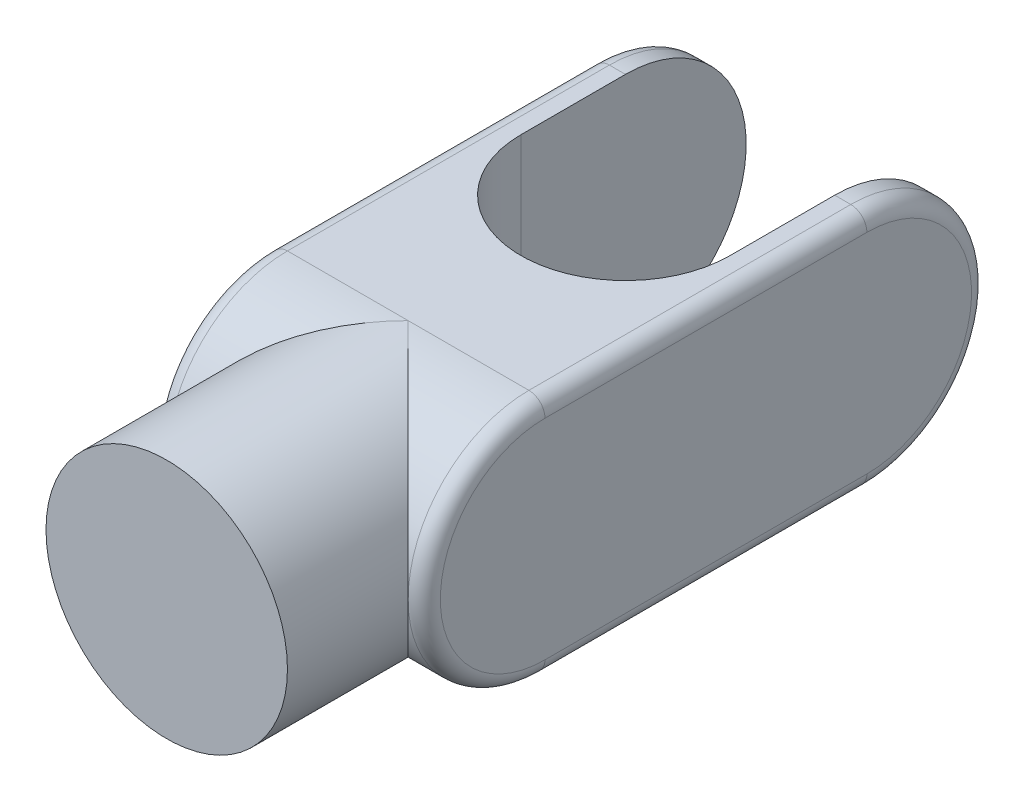
ISO-10303-21;
HEADER;
FILE_DESCRIPTION(('STEP AP214'),'2;1');
FILE_NAME('part.step','',(''),(''),'','','');
FILE_SCHEMA(('AUTOMOTIVE_DESIGN { 1 0 10303 214 1 1 1 1 }'));
ENDSEC;
DATA;
#1=APPLICATION_CONTEXT('core data for automotive mechanical design processes');
#2=APPLICATION_PROTOCOL_DEFINITION('international standard','automotive_design',2000,#1);
#3=PRODUCT_CONTEXT('',#1,'mechanical');
#4=PRODUCT('Part','Part','',(#3));
#5=PRODUCT_RELATED_PRODUCT_CATEGORY('part','',(#4));
#6=PRODUCT_DEFINITION_FORMATION('','',#4);
#7=PRODUCT_DEFINITION_CONTEXT('part definition',#1,'design');
#8=PRODUCT_DEFINITION('design','',#6,#7);
#9=PRODUCT_DEFINITION_SHAPE('','',#8);
#10=(LENGTH_UNIT() NAMED_UNIT(*) SI_UNIT(.MILLI.,.METRE.));
#11=(NAMED_UNIT(*) PLANE_ANGLE_UNIT() SI_UNIT($,.RADIAN.));
#12=(NAMED_UNIT(*) SI_UNIT($,.STERADIAN.) SOLID_ANGLE_UNIT());
#13=UNCERTAINTY_MEASURE_WITH_UNIT(LENGTH_MEASURE(1.E-05),#10,'distance_accuracy_value','');
#14=(GEOMETRIC_REPRESENTATION_CONTEXT(3) GLOBAL_UNCERTAINTY_ASSIGNED_CONTEXT((#13)) GLOBAL_UNIT_ASSIGNED_CONTEXT((#10,
#11,#12)) REPRESENTATION_CONTEXT('',''));
#15=CARTESIAN_POINT('',(0.,0.,0.));
#16=DIRECTION('',(0.,0.,1.));
#17=DIRECTION('',(1.,0.,0.));
#18=AXIS2_PLACEMENT_3D('',#15,#16,#17);
#19=CARTESIAN_POINT('',(170.,0.,-550.));
#20=DIRECTION('',(-1.,0.,0.));
#21=DIRECTION('',(0.,0.,1.));
#22=AXIS2_PLACEMENT_3D('',#19,#20,#21);
#23=CYLINDRICAL_SURFACE('',#22,150.);
#24=DIRECTION('',(-1.,0.,0.));
#25=VECTOR('',#24,1.);
#26=CARTESIAN_POINT('',(170.,150.,-550.));
#27=LINE('',#26,#25);
#28=CARTESIAN_POINT('',(-130.,150.,-550.));
#29=VERTEX_POINT('',#28);
#30=CARTESIAN_POINT('',(-150.,150.,-550.));
#31=VERTEX_POINT('',#30);
#32=EDGE_CURVE('E57',#29,#31,#27,.T.);
#33=ORIENTED_EDGE('',*,*,#32,.F.);
#34=CARTESIAN_POINT('',(-130.,0.,-550.));
#35=DIRECTION('',(-1.,0.,0.));
#36=DIRECTION('',(0.,0.,1.));
#37=AXIS2_PLACEMENT_3D('',#34,#35,#36);
#38=CIRCLE('',#37,150.);
#39=CARTESIAN_POINT('',(-130.,-150.,-550.));
#40=VERTEX_POINT('',#39);
#41=EDGE_CURVE('E141',#29,#40,#38,.T.);
#42=ORIENTED_EDGE('',*,*,#41,.T.);
#43=DIRECTION('',(-1.,0.,0.));
#44=VECTOR('',#43,1.);
#45=CARTESIAN_POINT('',(170.,-150.,-550.));
#46=LINE('',#45,#44);
#47=CARTESIAN_POINT('',(-150.,-150.,-550.));
#48=VERTEX_POINT('',#47);
#49=EDGE_CURVE('E171',#40,#48,#46,.T.);
#50=ORIENTED_EDGE('',*,*,#49,.T.);
#51=CARTESIAN_POINT('',(-150.,0.,-550.));
#52=DIRECTION('',(1.,0.,0.));
#53=DIRECTION('',(0.,0.,-1.));
#54=AXIS2_PLACEMENT_3D('',#51,#52,#53);
#55=CIRCLE('',#54,150.);
#56=EDGE_CURVE('E237',#48,#31,#55,.T.);
#57=ORIENTED_EDGE('',*,*,#56,.T.);
#58=EDGE_LOOP('',(#33,#42,#50,#57));
#59=FACE_BOUND('',#58,.T.);
#60=ADVANCED_FACE('F34',(#59),#23,.T.);
#61=CARTESIAN_POINT('',(170.,0.,-150.));
#62=DIRECTION('',(-1.,0.,0.));
#63=DIRECTION('',(0.,0.,1.));
#64=AXIS2_PLACEMENT_3D('',#61,#62,#63);
#65=CYLINDRICAL_SURFACE('',#64,150.);
#66=DIRECTION('',(-1.,0.,0.));
#67=VECTOR('',#66,1.);
#68=CARTESIAN_POINT('',(170.,150.,-150.));
#69=LINE('',#68,#67);
#70=CARTESIAN_POINT('',(0.,150.,-150.));
#71=VERTEX_POINT('',#70);
#72=CARTESIAN_POINT('',(-150.,150.,-150.));
#73=VERTEX_POINT('',#72);
#74=EDGE_CURVE('E167',#71,#73,#69,.T.);
#75=ORIENTED_EDGE('',*,*,#74,.T.);
#76=CARTESIAN_POINT('',(-150.,0.,-150.));
#77=DIRECTION('',(1.,0.,0.));
#78=DIRECTION('',(0.,0.,-1.));
#79=AXIS2_PLACEMENT_3D('',#76,#77,#78);
#80=CIRCLE('',#79,150.);
#81=CARTESIAN_POINT('',(-150.,0.,0.));
#82=VERTEX_POINT('',#81);
#83=EDGE_CURVE('E222',#73,#82,#80,.T.);
#84=ORIENTED_EDGE('',*,*,#83,.T.);
#85=CARTESIAN_POINT('',(0.,0.,-150.));
#86=DIRECTION('',(-0.707106781186547,0.,-0.707106781186547));
#87=DIRECTION('',(0.707106781186547,0.,-0.707106781186547));
#88=AXIS2_PLACEMENT_3D('',#85,#86,#87);
#89=ELLIPSE('',#88,212.132034355964,150.);
#90=EDGE_CURVE('E181',#82,#71,#89,.T.);
#91=ORIENTED_EDGE('',*,*,#90,.T.);
#92=EDGE_LOOP('',(#75,#84,#91));
#93=FACE_BOUND('',#92,.T.);
#94=ADVANCED_FACE('F293',(#93),#65,.T.);
#95=DIRECTION('',(-1.,0.,0.));
#96=VECTOR('',#95,1.);
#97=CARTESIAN_POINT('',(170.,-150.,-150.));
#98=LINE('',#97,#96);
#99=CARTESIAN_POINT('',(150.,-150.,-150.));
#100=VERTEX_POINT('',#99);
#101=CARTESIAN_POINT('',(0.,-150.,-150.));
#102=VERTEX_POINT('',#101);
#103=EDGE_CURVE('E175',#100,#102,#98,.T.);
#104=ORIENTED_EDGE('',*,*,#103,.F.);
#105=CARTESIAN_POINT('',(150.,0.,-150.));
#106=DIRECTION('',(1.,0.,0.));
#107=DIRECTION('',(0.,0.,-1.));
#108=AXIS2_PLACEMENT_3D('',#105,#106,#107);
#109=CIRCLE('',#108,150.);
#110=CARTESIAN_POINT('',(150.,0.,0.));
#111=VERTEX_POINT('',#110);
#112=EDGE_CURVE('E199',#100,#111,#109,.F.);
#113=ORIENTED_EDGE('',*,*,#112,.T.);
#114=CARTESIAN_POINT('',(0.,0.,-150.));
#115=DIRECTION('',(0.707106781186547,0.,-0.707106781186547));
#116=DIRECTION('',(-0.707106781186547,0.,-0.707106781186547));
#117=AXIS2_PLACEMENT_3D('',#114,#115,#116);
#118=ELLIPSE('',#117,212.132034355964,150.);
#119=EDGE_CURVE('E177',#111,#102,#118,.T.);
#120=ORIENTED_EDGE('',*,*,#119,.T.);
#121=EDGE_LOOP('',(#104,#113,#120));
#122=FACE_BOUND('',#121,.T.);
#123=ADVANCED_FACE('F280',(#122),#65,.T.);
#124=CARTESIAN_POINT('',(0.,0.,150.));
#125=DIRECTION('',(0.,0.,-1.));
#126=DIRECTION('',(-1.,0.,0.));
#127=AXIS2_PLACEMENT_3D('',#124,#125,#126);
#128=CYLINDRICAL_SURFACE('',#127,150.);
#129=CARTESIAN_POINT('',(0.,0.,150.));
#130=DIRECTION('',(0.,0.,1.));
#131=DIRECTION('',(1.,0.,0.));
#132=AXIS2_PLACEMENT_3D('',#129,#130,#131);
#133=CIRCLE('',#132,150.);
#134=CARTESIAN_POINT('',(150.,0.,150.));
#135=VERTEX_POINT('',#134);
#136=EDGE_CURVE('E185',#135,#135,#133,.T.);
#137=ORIENTED_EDGE('',*,*,#136,.F.);
#138=EDGE_LOOP('',(#137));
#139=FACE_BOUND('',#138,.T.);
#140=EDGE_CURVE('E182',#102,#82,#89,.T.);
#141=ORIENTED_EDGE('',*,*,#140,.F.);
#142=ORIENTED_EDGE('',*,*,#119,.F.);
#143=EDGE_CURVE('E178',#71,#111,#118,.T.);
#144=ORIENTED_EDGE('',*,*,#143,.F.);
#145=ORIENTED_EDGE('',*,*,#90,.F.);
#146=EDGE_LOOP('',(#141,#142,#144,#145));
#147=FACE_BOUND('',#146,.T.);
#148=ADVANCED_FACE('F320',(#139,#147),#128,.T.);
#149=CARTESIAN_POINT('',(0.,0.,150.));
#150=DIRECTION('',(0.,0.,1.));
#151=DIRECTION('',(1.,0.,0.));
#152=AXIS2_PLACEMENT_3D('',#149,#150,#151);
#153=PLANE('',#152);
#154=ORIENTED_EDGE('',*,*,#136,.T.);
#155=EDGE_LOOP('',(#154));
#156=FACE_BOUND('',#155,.T.);
#157=ADVANCED_FACE('F316',(#156),#153,.T.);
#158=ORIENTED_EDGE('',*,*,#140,.T.);
#159=CARTESIAN_POINT('',(-150.,0.,-150.));
#160=DIRECTION('',(1.,0.,0.));
#161=DIRECTION('',(0.,0.,-1.));
#162=AXIS2_PLACEMENT_3D('',#159,#160,#161);
#163=CIRCLE('',#162,150.);
#164=CARTESIAN_POINT('',(-150.,-150.,-150.));
#165=VERTEX_POINT('',#164);
#166=EDGE_CURVE('E208',#82,#165,#163,.T.);
#167=ORIENTED_EDGE('',*,*,#166,.T.);
#168=EDGE_CURVE('E174',#102,#165,#98,.T.);
#169=ORIENTED_EDGE('',*,*,#168,.F.);
#170=EDGE_LOOP('',(#158,#167,#169));
#171=FACE_BOUND('',#170,.T.);
#172=ADVANCED_FACE('F301',(#171),#65,.T.);
#173=ORIENTED_EDGE('',*,*,#143,.T.);
#174=CARTESIAN_POINT('',(150.,0.,-150.));
#175=DIRECTION('',(1.,0.,0.));
#176=DIRECTION('',(0.,0.,-1.));
#177=AXIS2_PLACEMENT_3D('',#174,#175,#176);
#178=CIRCLE('',#177,150.);
#179=CARTESIAN_POINT('',(150.,150.,-150.));
#180=VERTEX_POINT('',#179);
#181=EDGE_CURVE('E197',#111,#180,#178,.F.);
#182=ORIENTED_EDGE('',*,*,#181,.T.);
#183=EDGE_CURVE('E164',#180,#71,#69,.T.);
#184=ORIENTED_EDGE('',*,*,#183,.T.);
#185=EDGE_LOOP('',(#173,#182,#184));
#186=FACE_BOUND('',#185,.T.);
#187=ADVANCED_FACE('F309',(#186),#65,.T.);
#188=CARTESIAN_POINT('',(170.,-150.,-550.));
#189=DIRECTION('',(0.,-1.,0.));
#190=DIRECTION('',(0.,0.,-1.));
#191=AXIS2_PLACEMENT_3D('',#188,#189,#190);
#192=PLANE('',#191);
#193=DIRECTION('',(0.,0.,-1.));
#194=VECTOR('',#193,1.);
#195=CARTESIAN_POINT('',(-130.,-150.,-550.));
#196=LINE('',#195,#194);
#197=CARTESIAN_POINT('',(-130.,-150.,-420.));
#198=VERTEX_POINT('',#197);
#199=EDGE_CURVE('E155',#198,#40,#196,.T.);
#200=ORIENTED_EDGE('',*,*,#199,.F.);
#201=CARTESIAN_POINT('',(0.,-150.,-420.));
#202=DIRECTION('',(0.,-1.,0.));
#203=DIRECTION('',(0.,0.,-1.));
#204=AXIS2_PLACEMENT_3D('',#201,#202,#203);
#205=CIRCLE('',#204,130.);
#206=CARTESIAN_POINT('',(130.,-150.,-420.));
#207=VERTEX_POINT('',#206);
#208=EDGE_CURVE('E146',#207,#198,#205,.T.);
#209=ORIENTED_EDGE('',*,*,#208,.F.);
#210=DIRECTION('',(0.,0.,1.));
#211=VECTOR('',#210,1.);
#212=CARTESIAN_POINT('',(130.,-150.,-550.));
#213=LINE('',#212,#211);
#214=CARTESIAN_POINT('',(130.,-150.,-550.));
#215=VERTEX_POINT('',#214);
#216=EDGE_CURVE('E133',#215,#207,#213,.T.);
#217=ORIENTED_EDGE('',*,*,#216,.F.);
#218=CARTESIAN_POINT('',(150.,-150.,-550.));
#219=VERTEX_POINT('',#218);
#220=EDGE_CURVE('E172',#219,#215,#46,.T.);
#221=ORIENTED_EDGE('',*,*,#220,.F.);
#222=DIRECTION('',(0.,0.,1.));
#223=VECTOR('',#222,1.);
#224=CARTESIAN_POINT('',(150.,-150.,-550.));
#225=LINE('',#224,#223);
#226=EDGE_CURVE('E202',#219,#100,#225,.T.);
#227=ORIENTED_EDGE('',*,*,#226,.T.);
#228=ORIENTED_EDGE('',*,*,#103,.T.);
#229=ORIENTED_EDGE('',*,*,#168,.T.);
#230=DIRECTION('',(0.,0.,1.));
#231=VECTOR('',#230,1.);
#232=CARTESIAN_POINT('',(-150.,-150.,-550.));
#233=LINE('',#232,#231);
#234=EDGE_CURVE('E234',#165,#48,#233,.F.);
#235=ORIENTED_EDGE('',*,*,#234,.T.);
#236=ORIENTED_EDGE('',*,*,#49,.F.);
#237=EDGE_LOOP('',(#200,#209,#217,#221,#227,#228,#229,#235,#236));
#238=FACE_BOUND('',#237,.T.);
#239=ADVANCED_FACE('F153',(#238),#192,.T.);
#240=ORIENTED_EDGE('',*,*,#220,.T.);
#241=CARTESIAN_POINT('',(130.,0.,-550.));
#242=DIRECTION('',(1.,0.,0.));
#243=DIRECTION('',(0.,0.,-1.));
#244=AXIS2_PLACEMENT_3D('',#241,#242,#243);
#245=CIRCLE('',#244,150.);
#246=CARTESIAN_POINT('',(130.,150.,-550.));
#247=VERTEX_POINT('',#246);
#248=EDGE_CURVE('E136',#215,#247,#245,.T.);
#249=ORIENTED_EDGE('',*,*,#248,.T.);
#250=CARTESIAN_POINT('',(150.,150.,-550.));
#251=VERTEX_POINT('',#250);
#252=EDGE_CURVE('E168',#251,#247,#27,.T.);
#253=ORIENTED_EDGE('',*,*,#252,.F.);
#254=CARTESIAN_POINT('',(150.,0.,-550.));
#255=DIRECTION('',(1.,0.,0.));
#256=DIRECTION('',(0.,0.,-1.));
#257=AXIS2_PLACEMENT_3D('',#254,#255,#256);
#258=CIRCLE('',#257,150.);
#259=EDGE_CURVE('E204',#251,#219,#258,.F.);
#260=ORIENTED_EDGE('',*,*,#259,.T.);
#261=EDGE_LOOP('',(#240,#249,#253,#260));
#262=FACE_BOUND('',#261,.T.);
#263=ADVANCED_FACE('F250',(#262),#23,.T.);
#264=CARTESIAN_POINT('',(170.,150.,-150.));
#265=DIRECTION('',(0.,1.,0.));
#266=DIRECTION('',(0.,0.,1.));
#267=AXIS2_PLACEMENT_3D('',#264,#265,#266);
#268=PLANE('',#267);
#269=DIRECTION('',(0.,0.,1.));
#270=VECTOR('',#269,1.);
#271=CARTESIAN_POINT('',(-130.,150.,-150.));
#272=LINE('',#271,#270);
#273=CARTESIAN_POINT('',(-130.,150.,-420.));
#274=VERTEX_POINT('',#273);
#275=EDGE_CURVE('E11',#29,#274,#272,.T.);
#276=ORIENTED_EDGE('',*,*,#275,.F.);
#277=ORIENTED_EDGE('',*,*,#32,.T.);
#278=DIRECTION('',(0.,0.,-1.));
#279=VECTOR('',#278,1.);
#280=CARTESIAN_POINT('',(-150.,150.,-150.));
#281=LINE('',#280,#279);
#282=EDGE_CURVE('E239',#31,#73,#281,.F.);
#283=ORIENTED_EDGE('',*,*,#282,.T.);
#284=ORIENTED_EDGE('',*,*,#74,.F.);
#285=ORIENTED_EDGE('',*,*,#183,.F.);
#286=DIRECTION('',(0.,0.,-1.));
#287=VECTOR('',#286,1.);
#288=CARTESIAN_POINT('',(150.,150.,-150.));
#289=LINE('',#288,#287);
#290=EDGE_CURVE('E206',#180,#251,#289,.T.);
#291=ORIENTED_EDGE('',*,*,#290,.T.);
#292=ORIENTED_EDGE('',*,*,#252,.T.);
#293=DIRECTION('',(0.,0.,-1.));
#294=VECTOR('',#293,1.);
#295=CARTESIAN_POINT('',(130.,150.,-150.));
#296=LINE('',#295,#294);
#297=CARTESIAN_POINT('',(130.,150.,-420.));
#298=VERTEX_POINT('',#297);
#299=EDGE_CURVE('E240',#298,#247,#296,.T.);
#300=ORIENTED_EDGE('',*,*,#299,.F.);
#301=CARTESIAN_POINT('',(0.,150.,-420.));
#302=DIRECTION('',(0.,1.,0.));
#303=DIRECTION('',(0.,0.,1.));
#304=AXIS2_PLACEMENT_3D('',#301,#302,#303);
#305=CIRCLE('',#304,130.);
#306=EDGE_CURVE('E42',#274,#298,#305,.T.);
#307=ORIENTED_EDGE('',*,*,#306,.F.);
#308=EDGE_LOOP('',(#276,#277,#283,#284,#285,#291,#292,#300,#307));
#309=FACE_BOUND('',#308,.T.);
#310=ADVANCED_FACE('F253',(#309),#268,.T.);
#311=CARTESIAN_POINT('',(170.,0.,-150.));
#312=DIRECTION('',(1.,0.,0.));
#313=DIRECTION('',(0.,0.,-1.));
#314=AXIS2_PLACEMENT_3D('',#311,#312,#313);
#315=PLANE('',#314);
#316=DIRECTION('',(0.,0.,-1.));
#317=VECTOR('',#316,1.);
#318=CARTESIAN_POINT('',(170.,130.,-150.));
#319=LINE('',#318,#317);
#320=CARTESIAN_POINT('',(170.,130.,-550.));
#321=VERTEX_POINT('',#320);
#322=CARTESIAN_POINT('',(170.,130.,-150.));
#323=VERTEX_POINT('',#322);
#324=EDGE_CURVE('E188',#321,#323,#319,.F.);
#325=ORIENTED_EDGE('',*,*,#324,.T.);
#326=CARTESIAN_POINT('',(170.,0.,-150.));
#327=DIRECTION('',(1.,0.,0.));
#328=DIRECTION('',(0.,0.,-1.));
#329=AXIS2_PLACEMENT_3D('',#326,#327,#328);
#330=CIRCLE('',#329,130.);
#331=CARTESIAN_POINT('',(170.,-130.,-150.));
#332=VERTEX_POINT('',#331);
#333=EDGE_CURVE('E194',#323,#332,#330,.T.);
#334=ORIENTED_EDGE('',*,*,#333,.T.);
#335=DIRECTION('',(0.,0.,1.));
#336=VECTOR('',#335,1.);
#337=CARTESIAN_POINT('',(170.,-130.,-150.));
#338=LINE('',#337,#336);
#339=CARTESIAN_POINT('',(170.,-130.,-550.));
#340=VERTEX_POINT('',#339);
#341=EDGE_CURVE('E192',#332,#340,#338,.F.);
#342=ORIENTED_EDGE('',*,*,#341,.T.);
#343=CARTESIAN_POINT('',(170.,0.,-550.));
#344=DIRECTION('',(1.,0.,0.));
#345=DIRECTION('',(0.,0.,-1.));
#346=AXIS2_PLACEMENT_3D('',#343,#344,#345);
#347=CIRCLE('',#346,130.);
#348=EDGE_CURVE('E190',#340,#321,#347,.T.);
#349=ORIENTED_EDGE('',*,*,#348,.T.);
#350=EDGE_LOOP('',(#325,#334,#342,#349));
#351=FACE_BOUND('',#350,.T.);
#352=ADVANCED_FACE('F269',(#351),#315,.T.);
#353=CARTESIAN_POINT('',(-170.,0.,-150.));
#354=DIRECTION('',(1.,0.,0.));
#355=DIRECTION('',(0.,0.,-1.));
#356=AXIS2_PLACEMENT_3D('',#353,#354,#355);
#357=PLANE('',#356);
#358=DIRECTION('',(0.,0.,1.));
#359=VECTOR('',#358,1.);
#360=CARTESIAN_POINT('',(-170.,-130.,-150.));
#361=LINE('',#360,#359);
#362=CARTESIAN_POINT('',(-170.,-130.,-550.));
#363=VERTEX_POINT('',#362);
#364=CARTESIAN_POINT('',(-170.,-130.,-150.));
#365=VERTEX_POINT('',#364);
#366=EDGE_CURVE('E229',#363,#365,#361,.T.);
#367=ORIENTED_EDGE('',*,*,#366,.T.);
#368=CARTESIAN_POINT('',(-170.,0.,-150.));
#369=DIRECTION('',(1.,0.,0.));
#370=DIRECTION('',(0.,0.,-1.));
#371=AXIS2_PLACEMENT_3D('',#368,#369,#370);
#372=CIRCLE('',#371,130.);
#373=CARTESIAN_POINT('',(-170.,130.,-150.));
#374=VERTEX_POINT('',#373);
#375=EDGE_CURVE('E231',#365,#374,#372,.F.);
#376=ORIENTED_EDGE('',*,*,#375,.T.);
#377=DIRECTION('',(0.,0.,-1.));
#378=VECTOR('',#377,1.);
#379=CARTESIAN_POINT('',(-170.,130.,-550.));
#380=LINE('',#379,#378);
#381=CARTESIAN_POINT('',(-170.,130.,-550.));
#382=VERTEX_POINT('',#381);
#383=EDGE_CURVE('E225',#374,#382,#380,.T.);
#384=ORIENTED_EDGE('',*,*,#383,.T.);
#385=CARTESIAN_POINT('',(-170.,0.,-550.));
#386=DIRECTION('',(1.,0.,0.));
#387=DIRECTION('',(0.,0.,-1.));
#388=AXIS2_PLACEMENT_3D('',#385,#386,#387);
#389=CIRCLE('',#388,130.);
#390=EDGE_CURVE('E227',#382,#363,#389,.F.);
#391=ORIENTED_EDGE('',*,*,#390,.T.);
#392=EDGE_LOOP('',(#367,#376,#384,#391));
#393=FACE_BOUND('',#392,.T.);
#394=ADVANCED_FACE('F346',(#393),#357,.F.);
#395=CARTESIAN_POINT('',(150.,0.,-550.));
#396=DIRECTION('',(1.,0.,0.));
#397=DIRECTION('',(0.,0.,-1.));
#398=AXIS2_PLACEMENT_3D('',#395,#396,#397);
#399=TOROIDAL_SURFACE('',#398,130.,20.);
#400=CARTESIAN_POINT('',(150.,-130.,-550.));
#401=DIRECTION('',(0.,0.,1.));
#402=DIRECTION('',(1.,0.,0.));
#403=AXIS2_PLACEMENT_3D('',#400,#401,#402);
#404=CIRCLE('',#403,20.);
#405=EDGE_CURVE('E215',#219,#340,#404,.T.);
#406=ORIENTED_EDGE('',*,*,#405,.F.);
#407=ORIENTED_EDGE('',*,*,#259,.F.);
#408=CARTESIAN_POINT('',(150.,130.,-550.));
#409=DIRECTION('',(0.,0.,1.));
#410=DIRECTION('',(1.,0.,0.));
#411=AXIS2_PLACEMENT_3D('',#408,#409,#410);
#412=CIRCLE('',#411,20.);
#413=EDGE_CURVE('E218',#321,#251,#412,.T.);
#414=ORIENTED_EDGE('',*,*,#413,.F.);
#415=ORIENTED_EDGE('',*,*,#348,.F.);
#416=EDGE_LOOP('',(#406,#407,#414,#415));
#417=FACE_BOUND('',#416,.T.);
#418=ADVANCED_FACE('F273',(#417),#399,.T.);
#419=CARTESIAN_POINT('',(150.,130.,-150.));
#420=DIRECTION('',(0.,0.,-1.));
#421=DIRECTION('',(0.,1.,0.));
#422=AXIS2_PLACEMENT_3D('',#419,#420,#421);
#423=CYLINDRICAL_SURFACE('',#422,20.);
#424=ORIENTED_EDGE('',*,*,#413,.T.);
#425=ORIENTED_EDGE('',*,*,#290,.F.);
#426=CARTESIAN_POINT('',(150.,130.,-150.));
#427=DIRECTION('',(0.,0.,1.));
#428=DIRECTION('',(1.,0.,0.));
#429=AXIS2_PLACEMENT_3D('',#426,#427,#428);
#430=CIRCLE('',#429,20.);
#431=EDGE_CURVE('E211',#323,#180,#430,.T.);
#432=ORIENTED_EDGE('',*,*,#431,.F.);
#433=ORIENTED_EDGE('',*,*,#324,.F.);
#434=EDGE_LOOP('',(#424,#425,#432,#433));
#435=FACE_BOUND('',#434,.T.);
#436=ADVANCED_FACE('F259',(#435),#423,.T.);
#437=CARTESIAN_POINT('',(150.,-130.,-550.));
#438=DIRECTION('',(0.,0.,1.));
#439=DIRECTION('',(0.,-1.,0.));
#440=AXIS2_PLACEMENT_3D('',#437,#438,#439);
#441=CYLINDRICAL_SURFACE('',#440,20.);
#442=ORIENTED_EDGE('',*,*,#405,.T.);
#443=ORIENTED_EDGE('',*,*,#341,.F.);
#444=CARTESIAN_POINT('',(150.,-130.,-150.));
#445=DIRECTION('',(0.,0.,1.));
#446=DIRECTION('',(1.,0.,0.));
#447=AXIS2_PLACEMENT_3D('',#444,#445,#446);
#448=CIRCLE('',#447,20.);
#449=EDGE_CURVE('E209',#100,#332,#448,.T.);
#450=ORIENTED_EDGE('',*,*,#449,.F.);
#451=ORIENTED_EDGE('',*,*,#226,.F.);
#452=EDGE_LOOP('',(#442,#443,#450,#451));
#453=FACE_BOUND('',#452,.T.);
#454=ADVANCED_FACE('F283',(#453),#441,.T.);
#455=CARTESIAN_POINT('',(150.,0.,-150.));
#456=DIRECTION('',(1.,0.,0.));
#457=DIRECTION('',(0.,0.,-1.));
#458=AXIS2_PLACEMENT_3D('',#455,#456,#457);
#459=TOROIDAL_SURFACE('',#458,130.,20.);
#460=ORIENTED_EDGE('',*,*,#181,.F.);
#461=ORIENTED_EDGE('',*,*,#112,.F.);
#462=ORIENTED_EDGE('',*,*,#449,.T.);
#463=ORIENTED_EDGE('',*,*,#333,.F.);
#464=ORIENTED_EDGE('',*,*,#431,.T.);
#465=EDGE_LOOP('',(#460,#461,#462,#463,#464));
#466=FACE_BOUND('',#465,.T.);
#467=ADVANCED_FACE('F264',(#466),#459,.T.);
#468=CARTESIAN_POINT('',(-150.,0.,-550.));
#469=DIRECTION('',(1.,0.,0.));
#470=DIRECTION('',(0.,0.,-1.));
#471=AXIS2_PLACEMENT_3D('',#468,#469,#470);
#472=TOROIDAL_SURFACE('',#471,130.,20.);
#473=CARTESIAN_POINT('',(-150.,-130.,-550.));
#474=DIRECTION('',(0.,0.,1.));
#475=DIRECTION('',(1.,0.,0.));
#476=AXIS2_PLACEMENT_3D('',#473,#474,#475);
#477=CIRCLE('',#476,20.);
#478=EDGE_CURVE('E243',#363,#48,#477,.T.);
#479=ORIENTED_EDGE('',*,*,#478,.F.);
#480=ORIENTED_EDGE('',*,*,#390,.F.);
#481=CARTESIAN_POINT('',(-150.,130.,-550.));
#482=DIRECTION('',(0.,0.,1.));
#483=DIRECTION('',(1.,0.,0.));
#484=AXIS2_PLACEMENT_3D('',#481,#482,#483);
#485=CIRCLE('',#484,20.);
#486=EDGE_CURVE('E212',#31,#382,#485,.T.);
#487=ORIENTED_EDGE('',*,*,#486,.F.);
#488=ORIENTED_EDGE('',*,*,#56,.F.);
#489=EDGE_LOOP('',(#479,#480,#487,#488));
#490=FACE_BOUND('',#489,.T.);
#491=ADVANCED_FACE('F36',(#490),#472,.T.);
#492=CARTESIAN_POINT('',(-150.,130.,-150.));
#493=DIRECTION('',(0.,0.,1.));
#494=DIRECTION('',(0.,-1.,0.));
#495=AXIS2_PLACEMENT_3D('',#492,#493,#494);
#496=CYLINDRICAL_SURFACE('',#495,20.);
#497=ORIENTED_EDGE('',*,*,#486,.T.);
#498=ORIENTED_EDGE('',*,*,#383,.F.);
#499=CARTESIAN_POINT('',(-150.,130.,-150.));
#500=DIRECTION('',(0.,0.,1.));
#501=DIRECTION('',(1.,0.,0.));
#502=AXIS2_PLACEMENT_3D('',#499,#500,#501);
#503=CIRCLE('',#502,20.);
#504=EDGE_CURVE('E159',#73,#374,#503,.T.);
#505=ORIENTED_EDGE('',*,*,#504,.F.);
#506=ORIENTED_EDGE('',*,*,#282,.F.);
#507=EDGE_LOOP('',(#497,#498,#505,#506));
#508=FACE_BOUND('',#507,.T.);
#509=ADVANCED_FACE('F377',(#508),#496,.T.);
#510=CARTESIAN_POINT('',(-150.,-130.,-150.));
#511=DIRECTION('',(0.,0.,-1.));
#512=DIRECTION('',(0.,1.,0.));
#513=AXIS2_PLACEMENT_3D('',#510,#511,#512);
#514=CYLINDRICAL_SURFACE('',#513,20.);
#515=ORIENTED_EDGE('',*,*,#478,.T.);
#516=ORIENTED_EDGE('',*,*,#234,.F.);
#517=CARTESIAN_POINT('',(-150.,-130.,-150.));
#518=DIRECTION('',(0.,0.,1.));
#519=DIRECTION('',(1.,0.,0.));
#520=AXIS2_PLACEMENT_3D('',#517,#518,#519);
#521=CIRCLE('',#520,20.);
#522=EDGE_CURVE('E156',#365,#165,#521,.T.);
#523=ORIENTED_EDGE('',*,*,#522,.F.);
#524=ORIENTED_EDGE('',*,*,#366,.F.);
#525=EDGE_LOOP('',(#515,#516,#523,#524));
#526=FACE_BOUND('',#525,.T.);
#527=ADVANCED_FACE('F336',(#526),#514,.T.);
#528=CARTESIAN_POINT('',(-150.,0.,-150.));
#529=DIRECTION('',(1.,0.,0.));
#530=DIRECTION('',(0.,0.,-1.));
#531=AXIS2_PLACEMENT_3D('',#528,#529,#530);
#532=TOROIDAL_SURFACE('',#531,130.,20.);
#533=ORIENTED_EDGE('',*,*,#504,.T.);
#534=ORIENTED_EDGE('',*,*,#375,.F.);
#535=ORIENTED_EDGE('',*,*,#522,.T.);
#536=ORIENTED_EDGE('',*,*,#166,.F.);
#537=ORIENTED_EDGE('',*,*,#83,.F.);
#538=EDGE_LOOP('',(#533,#534,#535,#536,#537));
#539=FACE_BOUND('',#538,.T.);
#540=ADVANCED_FACE('F341',(#539),#532,.T.);
#541=CARTESIAN_POINT('',(0.,-170.,-420.));
#542=DIRECTION('',(0.,1.,0.));
#543=DIRECTION('',(0.,0.,1.));
#544=AXIS2_PLACEMENT_3D('',#541,#542,#543);
#545=CYLINDRICAL_SURFACE('',#544,130.);
#546=ORIENTED_EDGE('',*,*,#208,.T.);
#547=DIRECTION('',(0.,1.,0.));
#548=VECTOR('',#547,1.);
#549=CARTESIAN_POINT('',(-130.,-170.,-420.));
#550=LINE('',#549,#548);
#551=EDGE_CURVE('E150',#198,#274,#550,.T.);
#552=ORIENTED_EDGE('',*,*,#551,.T.);
#553=ORIENTED_EDGE('',*,*,#306,.T.);
#554=DIRECTION('',(0.,1.,0.));
#555=VECTOR('',#554,1.);
#556=CARTESIAN_POINT('',(130.,-170.,-420.));
#557=LINE('',#556,#555);
#558=EDGE_CURVE('E49',#207,#298,#557,.T.);
#559=ORIENTED_EDGE('',*,*,#558,.F.);
#560=EDGE_LOOP('',(#546,#552,#553,#559));
#561=FACE_BOUND('',#560,.T.);
#562=ADVANCED_FACE('F144',(#561),#545,.F.);
#563=CARTESIAN_POINT('',(-130.,-170.,-420.));
#564=DIRECTION('',(-1.,0.,0.));
#565=DIRECTION('',(0.,0.,1.));
#566=AXIS2_PLACEMENT_3D('',#563,#564,#565);
#567=PLANE('',#566);
#568=ORIENTED_EDGE('',*,*,#199,.T.);
#569=ORIENTED_EDGE('',*,*,#41,.F.);
#570=ORIENTED_EDGE('',*,*,#275,.T.);
#571=ORIENTED_EDGE('',*,*,#551,.F.);
#572=EDGE_LOOP('',(#568,#569,#570,#571));
#573=FACE_BOUND('',#572,.T.);
#574=ADVANCED_FACE('F354',(#573),#567,.F.);
#575=CARTESIAN_POINT('',(130.,-170.,-938.530561272072));
#576=DIRECTION('',(1.,0.,0.));
#577=DIRECTION('',(0.,0.,-1.));
#578=AXIS2_PLACEMENT_3D('',#575,#576,#577);
#579=PLANE('',#578);
#580=ORIENTED_EDGE('',*,*,#216,.T.);
#581=ORIENTED_EDGE('',*,*,#558,.T.);
#582=ORIENTED_EDGE('',*,*,#299,.T.);
#583=ORIENTED_EDGE('',*,*,#248,.F.);
#584=EDGE_LOOP('',(#580,#581,#582,#583));
#585=FACE_BOUND('',#584,.T.);
#586=ADVANCED_FACE('F134',(#585),#579,.F.);
#587=CLOSED_SHELL('',(#60,#94,#123,#148,#157,#172,#187,#239,#263,#310,#352,#394,#418,#436,#454,
#467,#491,#509,#527,#540,#562,#574,#586));
#588=MANIFOLD_SOLID_BREP('B2',#587);
#589=ADVANCED_BREP_SHAPE_REPRESENTATION('',(#18,#588),#14);
#590=SHAPE_DEFINITION_REPRESENTATION(#9,#589);
ENDSEC;
END-ISO-10303-21;
